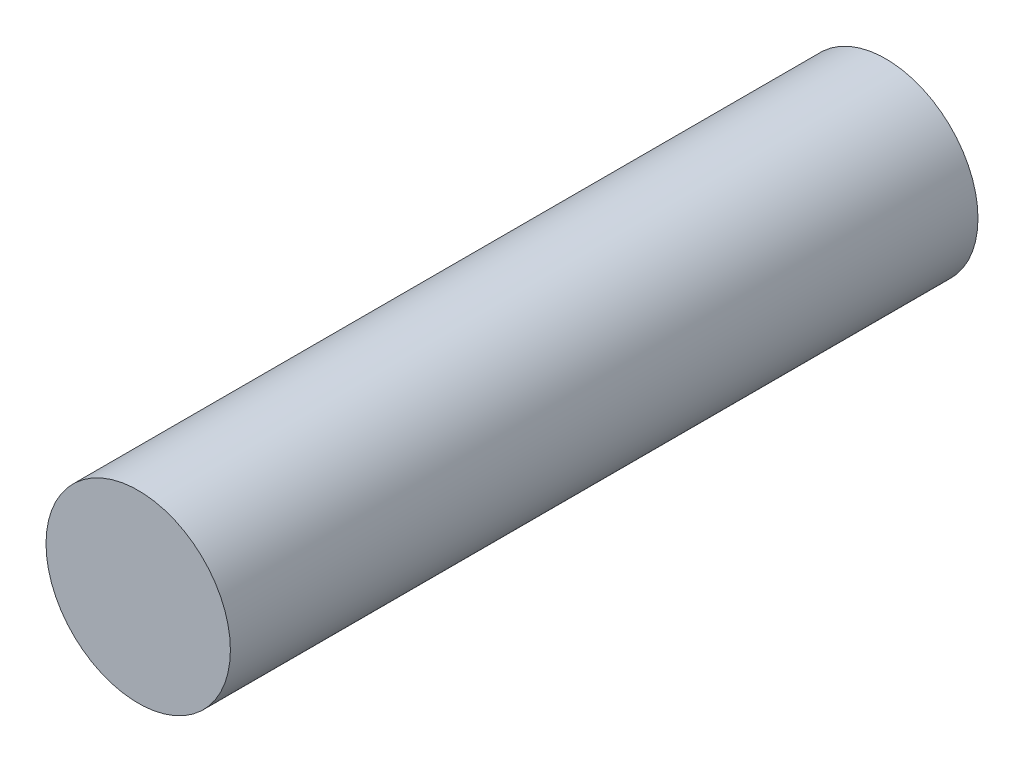
ISO-10303-21;
HEADER;
FILE_DESCRIPTION(('STEP AP214'),'2;1');
FILE_NAME('part.step','',(''),(''),'','','');
FILE_SCHEMA(('AUTOMOTIVE_DESIGN { 1 0 10303 214 1 1 1 1 }'));
ENDSEC;
DATA;
#1=APPLICATION_CONTEXT('core data for automotive mechanical design processes');
#2=APPLICATION_PROTOCOL_DEFINITION('international standard','automotive_design',2000,#1);
#3=PRODUCT_CONTEXT('',#1,'mechanical');
#4=PRODUCT('Part','Part','',(#3));
#5=PRODUCT_RELATED_PRODUCT_CATEGORY('part','',(#4));
#6=PRODUCT_DEFINITION_FORMATION('','',#4);
#7=PRODUCT_DEFINITION_CONTEXT('part definition',#1,'design');
#8=PRODUCT_DEFINITION('design','',#6,#7);
#9=PRODUCT_DEFINITION_SHAPE('','',#8);
#10=(LENGTH_UNIT() NAMED_UNIT(*) SI_UNIT(.MILLI.,.METRE.));
#11=(NAMED_UNIT(*) PLANE_ANGLE_UNIT() SI_UNIT($,.RADIAN.));
#12=(NAMED_UNIT(*) SI_UNIT($,.STERADIAN.) SOLID_ANGLE_UNIT());
#13=UNCERTAINTY_MEASURE_WITH_UNIT(LENGTH_MEASURE(1.E-05),#10,'distance_accuracy_value','');
#14=(GEOMETRIC_REPRESENTATION_CONTEXT(3) GLOBAL_UNCERTAINTY_ASSIGNED_CONTEXT((#13)) GLOBAL_UNIT_ASSIGNED_CONTEXT((#10,
#11,#12)) REPRESENTATION_CONTEXT('',''));
#15=CARTESIAN_POINT('',(0.,0.,0.));
#16=DIRECTION('',(0.,0.,1.));
#17=DIRECTION('',(1.,0.,0.));
#18=AXIS2_PLACEMENT_3D('',#15,#16,#17);
#19=CARTESIAN_POINT('',(0.,0.,38.1));
#20=DIRECTION('',(0.,0.,-1.));
#21=DIRECTION('',(-1.,0.,0.));
#22=AXIS2_PLACEMENT_3D('',#19,#20,#21);
#23=CYLINDRICAL_SURFACE('',#22,4.699);
#24=CARTESIAN_POINT('',(0.,0.,38.1));
#25=DIRECTION('',(0.,0.,1.));
#26=DIRECTION('',(1.,0.,0.));
#27=AXIS2_PLACEMENT_3D('',#24,#25,#26);
#28=CIRCLE('',#27,4.699);
#29=CARTESIAN_POINT('',(-4.699,0.,38.1));
#30=VERTEX_POINT('',#29);
#31=EDGE_CURVE('E10',#30,#30,#28,.T.);
#32=CARTESIAN_POINT('',(0.,0.,0.));
#33=DIRECTION('',(0.,0.,1.));
#34=DIRECTION('',(1.,0.,0.));
#35=AXIS2_PLACEMENT_3D('',#32,#33,#34);
#36=CIRCLE('',#35,4.699);
#37=CARTESIAN_POINT('',(-4.699,0.,0.));
#38=VERTEX_POINT('',#37);
#39=EDGE_CURVE('E33',#38,#38,#36,.T.);
#40=CARTESIAN_POINT('',(-4.699,0.,38.1));
#41=CARTESIAN_POINT('',(-4.699,0.,37.703125));
#42=CARTESIAN_POINT('',(-4.699,0.,37.30625));
#43=CARTESIAN_POINT('',(-4.699,0.,36.5125));
#44=CARTESIAN_POINT('',(-4.699,0.,36.115625));
#45=CARTESIAN_POINT('',(-4.699,0.,35.321875));
#46=CARTESIAN_POINT('',(-4.699,0.,34.925));
#47=CARTESIAN_POINT('',(-4.699,0.,34.13125));
#48=CARTESIAN_POINT('',(-4.699,0.,33.734375));
#49=CARTESIAN_POINT('',(-4.699,0.,32.940625));
#50=CARTESIAN_POINT('',(-4.699,0.,32.54375));
#51=CARTESIAN_POINT('',(-4.699,0.,31.75));
#52=CARTESIAN_POINT('',(-4.699,0.,31.353125));
#53=CARTESIAN_POINT('',(-4.699,0.,30.559375));
#54=CARTESIAN_POINT('',(-4.699,0.,30.1625));
#55=CARTESIAN_POINT('',(-4.699,0.,29.36875));
#56=CARTESIAN_POINT('',(-4.699,0.,28.971875));
#57=CARTESIAN_POINT('',(-4.699,0.,28.178125));
#58=CARTESIAN_POINT('',(-4.699,0.,27.78125));
#59=CARTESIAN_POINT('',(-4.699,0.,26.9875));
#60=CARTESIAN_POINT('',(-4.699,0.,26.590625));
#61=CARTESIAN_POINT('',(-4.699,0.,25.796875));
#62=CARTESIAN_POINT('',(-4.699,0.,25.4));
#63=CARTESIAN_POINT('',(-4.699,0.,24.60625));
#64=CARTESIAN_POINT('',(-4.699,0.,24.209375));
#65=CARTESIAN_POINT('',(-4.699,0.,23.415625));
#66=CARTESIAN_POINT('',(-4.699,0.,23.01875));
#67=CARTESIAN_POINT('',(-4.699,0.,22.225));
#68=CARTESIAN_POINT('',(-4.699,0.,21.828125));
#69=CARTESIAN_POINT('',(-4.699,0.,21.034375));
#70=CARTESIAN_POINT('',(-4.699,0.,20.6375));
#71=CARTESIAN_POINT('',(-4.699,0.,19.84375));
#72=CARTESIAN_POINT('',(-4.699,0.,19.446875));
#73=CARTESIAN_POINT('',(-4.699,0.,18.653125));
#74=CARTESIAN_POINT('',(-4.699,0.,18.25625));
#75=CARTESIAN_POINT('',(-4.699,0.,17.4625));
#76=CARTESIAN_POINT('',(-4.699,0.,17.065625));
#77=CARTESIAN_POINT('',(-4.699,0.,16.271875));
#78=CARTESIAN_POINT('',(-4.699,0.,15.875));
#79=CARTESIAN_POINT('',(-4.699,0.,15.08125));
#80=CARTESIAN_POINT('',(-4.699,0.,14.684375));
#81=CARTESIAN_POINT('',(-4.699,0.,13.890625));
#82=CARTESIAN_POINT('',(-4.699,0.,13.49375));
#83=CARTESIAN_POINT('',(-4.699,0.,12.7));
#84=CARTESIAN_POINT('',(-4.699,0.,12.303125));
#85=CARTESIAN_POINT('',(-4.699,0.,11.509375));
#86=CARTESIAN_POINT('',(-4.699,0.,11.1125));
#87=CARTESIAN_POINT('',(-4.699,0.,10.31875));
#88=CARTESIAN_POINT('',(-4.699,0.,9.92187499999999));
#89=CARTESIAN_POINT('',(-4.699,0.,9.128125));
#90=CARTESIAN_POINT('',(-4.699,0.,8.73124999999999));
#91=CARTESIAN_POINT('',(-4.699,0.,7.93749999999999));
#92=CARTESIAN_POINT('',(-4.699,0.,7.54062499999999));
#93=CARTESIAN_POINT('',(-4.699,0.,6.746875));
#94=CARTESIAN_POINT('',(-4.699,0.,6.35));
#95=CARTESIAN_POINT('',(-4.699,0.,5.55625));
#96=CARTESIAN_POINT('',(-4.699,0.,5.159375));
#97=CARTESIAN_POINT('',(-4.699,0.,4.365625));
#98=CARTESIAN_POINT('',(-4.699,0.,3.96875));
#99=CARTESIAN_POINT('',(-4.699,0.,3.175));
#100=CARTESIAN_POINT('',(-4.699,0.,2.778125));
#101=CARTESIAN_POINT('',(-4.699,0.,1.984375));
#102=CARTESIAN_POINT('',(-4.699,0.,1.5875));
#103=CARTESIAN_POINT('',(-4.699,0.,0.79375));
#104=CARTESIAN_POINT('',(-4.699,0.,0.396875));
#105=CARTESIAN_POINT('',(-4.699,0.,0.));
#106=B_SPLINE_CURVE_WITH_KNOTS('',3,(#40,#41,#42,#43,#44,#45,#46,#47,#48,#49,#50,#51,#52,#53,
#54,#55,#56,#57,#58,#59,#60,#61,#62,#63,#64,#65,#66,#67,#68,#69,#70,#71,#72,#73,#74,#75,#76,#77,
#78,#79,#80,#81,#82,#83,#84,#85,#86,#87,#88,#89,#90,#91,#92,#93,#94,#95,#96,#97,#98,#99,#100,
#101,#102,#103,#104,#105),.UNSPECIFIED.,.F.,.F.,(4,2,2,2,2,2,2,2,2,2,2,2,2,2,2,2,2,2,2,2,2,2,2,
2,2,2,2,2,2,2,2,2,4),(0.,1.190625,2.38125,3.571875,4.7625,5.953125,7.14375,8.334375,
9.52500000000001,10.715625,11.90625,13.096875,14.2875,15.478125,16.66875,17.859375,19.05,
20.240625,21.43125,22.621875,23.8125,25.003125,26.19375,27.384375,28.575,29.765625,30.95625,
32.146875,33.3375,34.528125,35.71875,36.909375,38.1),.UNSPECIFIED.);
#107=EDGE_CURVE('BSEAM30',#30,#38,#106,.T.);
#108=ORIENTED_EDGE('',*,*,#31,.F.);
#109=ORIENTED_EDGE('',*,*,#39,.T.);
#110=ORIENTED_EDGE('',*,*,#107,.T.);
#111=ORIENTED_EDGE('',*,*,#107,.F.);
#112=EDGE_LOOP('',(#108,#110,#109,#111));
#113=FACE_BOUND('',#112,.T.);
#114=ADVANCED_FACE('F30',(#113),#23,.T.);
#115=CARTESIAN_POINT('',(0.,0.,38.1));
#116=DIRECTION('',(0.,0.,1.));
#117=DIRECTION('',(1.,0.,0.));
#118=AXIS2_PLACEMENT_3D('',#115,#116,#117);
#119=PLANE('',#118);
#120=ORIENTED_EDGE('',*,*,#31,.T.);
#121=EDGE_LOOP('',(#120));
#122=FACE_BOUND('',#121,.T.);
#123=ADVANCED_FACE('F45',(#122),#119,.T.);
#124=CARTESIAN_POINT('',(0.,0.,0.));
#125=DIRECTION('',(0.,0.,1.));
#126=DIRECTION('',(1.,0.,0.));
#127=AXIS2_PLACEMENT_3D('',#124,#125,#126);
#128=PLANE('',#127);
#129=ORIENTED_EDGE('',*,*,#39,.F.);
#130=EDGE_LOOP('',(#129));
#131=FACE_BOUND('',#130,.T.);
#132=ADVANCED_FACE('F43',(#131),#128,.F.);
#133=CLOSED_SHELL('',(#114,#123,#132));
#134=MANIFOLD_SOLID_BREP('B2',#133);
#135=ADVANCED_BREP_SHAPE_REPRESENTATION('',(#18,#134),#14);
#136=SHAPE_DEFINITION_REPRESENTATION(#9,#135);
ENDSEC;
END-ISO-10303-21;
